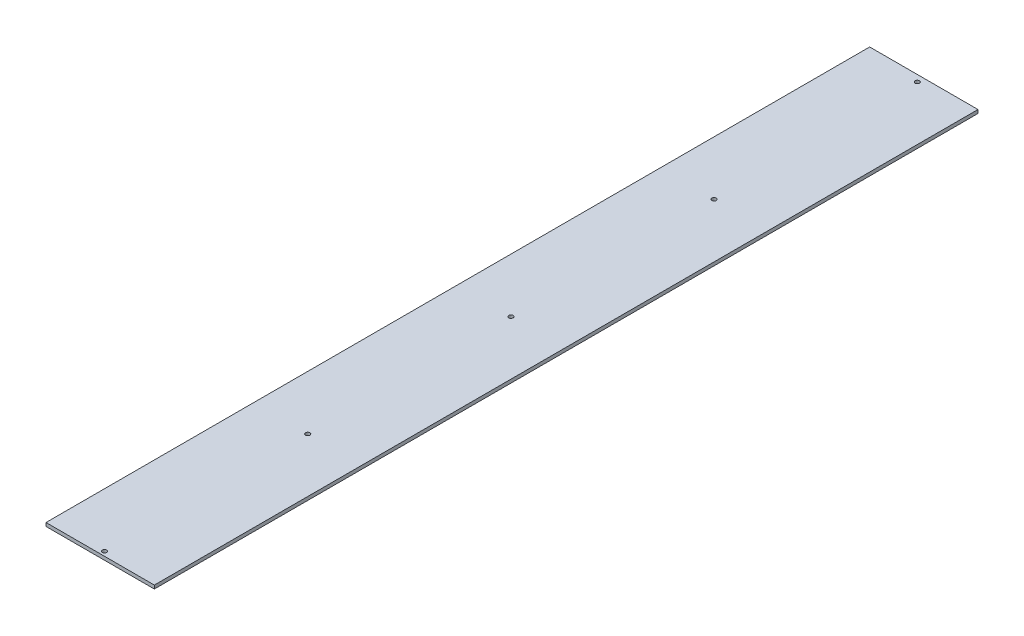
ISO-10303-21;
HEADER;
FILE_DESCRIPTION(('STEP AP214'),'2;1');
FILE_NAME('part.step','',(''),(''),'','','');
FILE_SCHEMA(('AUTOMOTIVE_DESIGN { 1 0 10303 214 1 1 1 1 }'));
ENDSEC;
DATA;
#1=APPLICATION_CONTEXT('core data for automotive mechanical design processes');
#2=APPLICATION_PROTOCOL_DEFINITION('international standard','automotive_design',2000,#1);
#3=PRODUCT_CONTEXT('',#1,'mechanical');
#4=PRODUCT('Part','Part','',(#3));
#5=PRODUCT_RELATED_PRODUCT_CATEGORY('part','',(#4));
#6=PRODUCT_DEFINITION_FORMATION('','',#4);
#7=PRODUCT_DEFINITION_CONTEXT('part definition',#1,'design');
#8=PRODUCT_DEFINITION('design','',#6,#7);
#9=PRODUCT_DEFINITION_SHAPE('','',#8);
#10=(LENGTH_UNIT() NAMED_UNIT(*) SI_UNIT(.MILLI.,.METRE.));
#11=(NAMED_UNIT(*) PLANE_ANGLE_UNIT() SI_UNIT($,.RADIAN.));
#12=(NAMED_UNIT(*) SI_UNIT($,.STERADIAN.) SOLID_ANGLE_UNIT());
#13=UNCERTAINTY_MEASURE_WITH_UNIT(LENGTH_MEASURE(1.E-05),#10,'distance_accuracy_value','');
#14=(GEOMETRIC_REPRESENTATION_CONTEXT(3) GLOBAL_UNCERTAINTY_ASSIGNED_CONTEXT((#13)) GLOBAL_UNIT_ASSIGNED_CONTEXT((#10,
#11,#12)) REPRESENTATION_CONTEXT('',''));
#15=CARTESIAN_POINT('',(0.,0.,0.));
#16=DIRECTION('',(0.,0.,1.));
#17=DIRECTION('',(1.,0.,0.));
#18=AXIS2_PLACEMENT_3D('',#15,#16,#17);
#19=CARTESIAN_POINT('',(25.,-1.6,190.075));
#20=DIRECTION('',(1.,0.,0.));
#21=DIRECTION('',(0.,0.,-1.));
#22=AXIS2_PLACEMENT_3D('',#19,#20,#21);
#23=PLANE('',#22);
#24=DIRECTION('',(0.,0.,-1.));
#25=VECTOR('',#24,1.);
#26=CARTESIAN_POINT('',(25.,0.,190.075));
#27=LINE('',#26,#25);
#28=CARTESIAN_POINT('',(25.,0.,190.075));
#29=VERTEX_POINT('',#28);
#30=CARTESIAN_POINT('',(25.,0.,-190.075));
#31=VERTEX_POINT('',#30);
#32=EDGE_CURVE('E109',#29,#31,#27,.T.);
#33=ORIENTED_EDGE('',*,*,#32,.F.);
#34=DIRECTION('',(0.,1.,0.));
#35=VECTOR('',#34,1.);
#36=CARTESIAN_POINT('',(25.,-1.6,190.075));
#37=LINE('',#36,#35);
#38=CARTESIAN_POINT('',(25.,-1.6,190.075));
#39=VERTEX_POINT('',#38);
#40=EDGE_CURVE('E56',#39,#29,#37,.T.);
#41=ORIENTED_EDGE('',*,*,#40,.F.);
#42=DIRECTION('',(0.,0.,-1.));
#43=VECTOR('',#42,1.);
#44=CARTESIAN_POINT('',(25.,-1.6,190.075));
#45=LINE('',#44,#43);
#46=CARTESIAN_POINT('',(25.,-1.6,-190.075));
#47=VERTEX_POINT('',#46);
#48=EDGE_CURVE('E102',#39,#47,#45,.T.);
#49=ORIENTED_EDGE('',*,*,#48,.T.);
#50=DIRECTION('',(0.,1.,0.));
#51=VECTOR('',#50,1.);
#52=CARTESIAN_POINT('',(25.,-1.6,-190.075));
#53=LINE('',#52,#51);
#54=EDGE_CURVE('E84',#47,#31,#53,.T.);
#55=ORIENTED_EDGE('',*,*,#54,.T.);
#56=EDGE_LOOP('',(#33,#41,#49,#55));
#57=FACE_BOUND('',#56,.T.);
#58=ADVANCED_FACE('F39',(#57),#23,.T.);
#59=CARTESIAN_POINT('',(-25.,-1.6,190.075));
#60=DIRECTION('',(0.,0.,1.));
#61=DIRECTION('',(1.,0.,0.));
#62=AXIS2_PLACEMENT_3D('',#59,#60,#61);
#63=PLANE('',#62);
#64=DIRECTION('',(1.,0.,0.));
#65=VECTOR('',#64,1.);
#66=CARTESIAN_POINT('',(-25.,0.,190.075));
#67=LINE('',#66,#65);
#68=CARTESIAN_POINT('',(-25.,0.,190.075));
#69=VERTEX_POINT('',#68);
#70=EDGE_CURVE('E104',#69,#29,#67,.T.);
#71=ORIENTED_EDGE('',*,*,#70,.F.);
#72=DIRECTION('',(0.,1.,0.));
#73=VECTOR('',#72,1.);
#74=CARTESIAN_POINT('',(-25.,-1.6,190.075));
#75=LINE('',#74,#73);
#76=CARTESIAN_POINT('',(-25.,-1.6,190.075));
#77=VERTEX_POINT('',#76);
#78=EDGE_CURVE('E73',#77,#69,#75,.T.);
#79=ORIENTED_EDGE('',*,*,#78,.F.);
#80=DIRECTION('',(1.,0.,0.));
#81=VECTOR('',#80,1.);
#82=CARTESIAN_POINT('',(-25.,-1.6,190.075));
#83=LINE('',#82,#81);
#84=EDGE_CURVE('E99',#77,#39,#83,.T.);
#85=ORIENTED_EDGE('',*,*,#84,.T.);
#86=ORIENTED_EDGE('',*,*,#40,.T.);
#87=EDGE_LOOP('',(#71,#79,#85,#86));
#88=FACE_BOUND('',#87,.T.);
#89=ADVANCED_FACE('F153',(#88),#63,.T.);
#90=CARTESIAN_POINT('',(-25.,-1.6,190.075));
#91=DIRECTION('',(-1.,0.,0.));
#92=DIRECTION('',(0.,0.,1.));
#93=AXIS2_PLACEMENT_3D('',#90,#91,#92);
#94=PLANE('',#93);
#95=DIRECTION('',(0.,0.,1.));
#96=VECTOR('',#95,1.);
#97=CARTESIAN_POINT('',(-25.,0.,190.075));
#98=LINE('',#97,#96);
#99=CARTESIAN_POINT('',(-25.,0.,-190.075));
#100=VERTEX_POINT('',#99);
#101=EDGE_CURVE('E92',#100,#69,#98,.T.);
#102=ORIENTED_EDGE('',*,*,#101,.F.);
#103=DIRECTION('',(0.,1.,0.));
#104=VECTOR('',#103,1.);
#105=CARTESIAN_POINT('',(-25.,-1.6,-190.075));
#106=LINE('',#105,#104);
#107=CARTESIAN_POINT('',(-25.,-1.6,-190.075));
#108=VERTEX_POINT('',#107);
#109=EDGE_CURVE('E87',#108,#100,#106,.T.);
#110=ORIENTED_EDGE('',*,*,#109,.F.);
#111=DIRECTION('',(0.,0.,1.));
#112=VECTOR('',#111,1.);
#113=CARTESIAN_POINT('',(-25.,-1.6,190.075));
#114=LINE('',#113,#112);
#115=EDGE_CURVE('E90',#108,#77,#114,.T.);
#116=ORIENTED_EDGE('',*,*,#115,.T.);
#117=ORIENTED_EDGE('',*,*,#78,.T.);
#118=EDGE_LOOP('',(#102,#110,#116,#117));
#119=FACE_BOUND('',#118,.T.);
#120=ADVANCED_FACE('F89',(#119),#94,.T.);
#121=CARTESIAN_POINT('',(-25.,-1.6,-190.075));
#122=DIRECTION('',(0.,0.,-1.));
#123=DIRECTION('',(-1.,0.,0.));
#124=AXIS2_PLACEMENT_3D('',#121,#122,#123);
#125=PLANE('',#124);
#126=DIRECTION('',(-1.,0.,0.));
#127=VECTOR('',#126,1.);
#128=CARTESIAN_POINT('',(-25.,0.,-190.075));
#129=LINE('',#128,#127);
#130=EDGE_CURVE('E112',#31,#100,#129,.T.);
#131=ORIENTED_EDGE('',*,*,#130,.F.);
#132=ORIENTED_EDGE('',*,*,#54,.F.);
#133=DIRECTION('',(-1.,0.,0.));
#134=VECTOR('',#133,1.);
#135=CARTESIAN_POINT('',(-25.,-1.6,-190.075));
#136=LINE('',#135,#134);
#137=EDGE_CURVE('E98',#47,#108,#136,.T.);
#138=ORIENTED_EDGE('',*,*,#137,.T.);
#139=ORIENTED_EDGE('',*,*,#109,.T.);
#140=EDGE_LOOP('',(#131,#132,#138,#139));
#141=FACE_BOUND('',#140,.T.);
#142=ADVANCED_FACE('F101',(#141),#125,.T.);
#143=CARTESIAN_POINT('',(0.,-1.6,0.));
#144=DIRECTION('',(0.,-1.,0.));
#145=DIRECTION('',(0.,0.,-1.));
#146=AXIS2_PLACEMENT_3D('',#143,#144,#145);
#147=PLANE('',#146);
#148=CARTESIAN_POINT('',(0.,-1.6,-93.2875));
#149=DIRECTION('',(0.,-1.,0.));
#150=DIRECTION('',(0.,0.,-1.));
#151=AXIS2_PLACEMENT_3D('',#148,#149,#150);
#152=CIRCLE('',#151,1.);
#153=CARTESIAN_POINT('',(0.,-1.6,-94.2875));
#154=VERTEX_POINT('',#153);
#155=EDGE_CURVE('E276',#154,#154,#152,.T.);
#156=ORIENTED_EDGE('',*,*,#155,.F.);
#157=EDGE_LOOP('',(#156));
#158=FACE_BOUND('',#157,.T.);
#159=CARTESIAN_POINT('',(0.,-1.6,-187.075));
#160=DIRECTION('',(0.,-1.,0.));
#161=DIRECTION('',(0.,0.,-1.));
#162=AXIS2_PLACEMENT_3D('',#159,#160,#161);
#163=CIRCLE('',#162,1.);
#164=CARTESIAN_POINT('',(0.,-1.6,-188.075));
#165=VERTEX_POINT('',#164);
#166=EDGE_CURVE('E113',#165,#165,#163,.T.);
#167=ORIENTED_EDGE('',*,*,#166,.F.);
#168=EDGE_LOOP('',(#167));
#169=FACE_BOUND('',#168,.T.);
#170=ORIENTED_EDGE('',*,*,#48,.F.);
#171=ORIENTED_EDGE('',*,*,#84,.F.);
#172=ORIENTED_EDGE('',*,*,#115,.F.);
#173=ORIENTED_EDGE('',*,*,#137,.F.);
#174=EDGE_LOOP('',(#170,#171,#172,#173));
#175=FACE_BOUND('',#174,.T.);
#176=CARTESIAN_POINT('',(0.,-1.6,0.5));
#177=DIRECTION('',(0.,-1.,0.));
#178=DIRECTION('',(0.,0.,-1.));
#179=AXIS2_PLACEMENT_3D('',#176,#177,#178);
#180=CIRCLE('',#179,1.);
#181=CARTESIAN_POINT('',(0.,-1.6,-0.5));
#182=VERTEX_POINT('',#181);
#183=EDGE_CURVE('E119',#182,#182,#180,.T.);
#184=ORIENTED_EDGE('',*,*,#183,.F.);
#185=EDGE_LOOP('',(#184));
#186=FACE_BOUND('',#185,.T.);
#187=CARTESIAN_POINT('',(0.,-1.6,94.2875));
#188=DIRECTION('',(0.,-1.,0.));
#189=DIRECTION('',(0.,0.,-1.));
#190=AXIS2_PLACEMENT_3D('',#187,#188,#189);
#191=CIRCLE('',#190,1.);
#192=CARTESIAN_POINT('',(0.,-1.6,93.2875));
#193=VERTEX_POINT('',#192);
#194=EDGE_CURVE('E127',#193,#193,#191,.T.);
#195=ORIENTED_EDGE('',*,*,#194,.F.);
#196=EDGE_LOOP('',(#195));
#197=FACE_BOUND('',#196,.T.);
#198=CARTESIAN_POINT('',(0.,-1.6,188.075));
#199=DIRECTION('',(0.,-1.,0.));
#200=DIRECTION('',(0.,0.,-1.));
#201=AXIS2_PLACEMENT_3D('',#198,#199,#200);
#202=CIRCLE('',#201,1.);
#203=CARTESIAN_POINT('',(0.,-1.6,187.075));
#204=VERTEX_POINT('',#203);
#205=EDGE_CURVE('E48',#204,#204,#202,.T.);
#206=ORIENTED_EDGE('',*,*,#205,.F.);
#207=EDGE_LOOP('',(#206));
#208=FACE_BOUND('',#207,.T.);
#209=ADVANCED_FACE('F96',(#158,#169,#175,#186,#197,#208),#147,.T.);
#210=CARTESIAN_POINT('',(0.,0.,0.));
#211=DIRECTION('',(0.,-1.,0.));
#212=DIRECTION('',(0.,0.,-1.));
#213=AXIS2_PLACEMENT_3D('',#210,#211,#212);
#214=PLANE('',#213);
#215=CARTESIAN_POINT('',(0.,0.,-93.2875));
#216=DIRECTION('',(0.,1.,0.));
#217=DIRECTION('',(0.,0.,1.));
#218=AXIS2_PLACEMENT_3D('',#215,#216,#217);
#219=CIRCLE('',#218,1.);
#220=CARTESIAN_POINT('',(0.,0.,-92.2875));
#221=VERTEX_POINT('',#220);
#222=EDGE_CURVE('E273',#221,#221,#219,.T.);
#223=ORIENTED_EDGE('',*,*,#222,.F.);
#224=EDGE_LOOP('',(#223));
#225=FACE_BOUND('',#224,.T.);
#226=CARTESIAN_POINT('',(0.,0.,-187.075));
#227=DIRECTION('',(0.,1.,0.));
#228=DIRECTION('',(0.,0.,1.));
#229=AXIS2_PLACEMENT_3D('',#226,#227,#228);
#230=CIRCLE('',#229,1.);
#231=CARTESIAN_POINT('',(0.,0.,-186.075));
#232=VERTEX_POINT('',#231);
#233=EDGE_CURVE('E271',#232,#232,#230,.T.);
#234=ORIENTED_EDGE('',*,*,#233,.F.);
#235=EDGE_LOOP('',(#234));
#236=FACE_BOUND('',#235,.T.);
#237=ORIENTED_EDGE('',*,*,#32,.T.);
#238=ORIENTED_EDGE('',*,*,#130,.T.);
#239=ORIENTED_EDGE('',*,*,#101,.T.);
#240=ORIENTED_EDGE('',*,*,#70,.T.);
#241=EDGE_LOOP('',(#237,#238,#239,#240));
#242=FACE_BOUND('',#241,.T.);
#243=CARTESIAN_POINT('',(0.,0.,0.5));
#244=DIRECTION('',(0.,1.,0.));
#245=DIRECTION('',(0.,0.,1.));
#246=AXIS2_PLACEMENT_3D('',#243,#244,#245);
#247=CIRCLE('',#246,1.);
#248=CARTESIAN_POINT('',(0.,0.,1.5));
#249=VERTEX_POINT('',#248);
#250=EDGE_CURVE('E124',#249,#249,#247,.T.);
#251=ORIENTED_EDGE('',*,*,#250,.F.);
#252=EDGE_LOOP('',(#251));
#253=FACE_BOUND('',#252,.T.);
#254=CARTESIAN_POINT('',(0.,0.,94.2875));
#255=DIRECTION('',(0.,1.,0.));
#256=DIRECTION('',(0.,0.,1.));
#257=AXIS2_PLACEMENT_3D('',#254,#255,#256);
#258=CIRCLE('',#257,1.);
#259=CARTESIAN_POINT('',(0.,0.,95.2875));
#260=VERTEX_POINT('',#259);
#261=EDGE_CURVE('E130',#260,#260,#258,.T.);
#262=ORIENTED_EDGE('',*,*,#261,.F.);
#263=EDGE_LOOP('',(#262));
#264=FACE_BOUND('',#263,.T.);
#265=CARTESIAN_POINT('',(0.,0.,188.075));
#266=DIRECTION('',(0.,1.,0.));
#267=DIRECTION('',(0.,0.,1.));
#268=AXIS2_PLACEMENT_3D('',#265,#266,#267);
#269=CIRCLE('',#268,1.);
#270=CARTESIAN_POINT('',(0.,0.,189.075));
#271=VERTEX_POINT('',#270);
#272=EDGE_CURVE('E11',#271,#271,#269,.T.);
#273=ORIENTED_EDGE('',*,*,#272,.F.);
#274=EDGE_LOOP('',(#273));
#275=FACE_BOUND('',#274,.T.);
#276=ADVANCED_FACE('F138',(#225,#236,#242,#253,#264,#275),#214,.F.);
#277=CARTESIAN_POINT('',(0.,-10.,-187.075));
#278=DIRECTION('',(0.,1.,0.));
#279=DIRECTION('',(0.,0.,1.));
#280=AXIS2_PLACEMENT_3D('',#277,#278,#279);
#281=CYLINDRICAL_SURFACE('',#280,1.);
#282=ORIENTED_EDGE('',*,*,#166,.T.);
#283=EDGE_LOOP('',(#282));
#284=FACE_BOUND('',#283,.T.);
#285=ORIENTED_EDGE('',*,*,#233,.T.);
#286=EDGE_LOOP('',(#285));
#287=FACE_BOUND('',#286,.T.);
#288=ADVANCED_FACE('F145',(#284,#287),#281,.F.);
#289=CARTESIAN_POINT('',(0.,-10.,-93.2875));
#290=DIRECTION('',(0.,1.,0.));
#291=DIRECTION('',(0.,0.,1.));
#292=AXIS2_PLACEMENT_3D('',#289,#290,#291);
#293=CYLINDRICAL_SURFACE('',#292,1.);
#294=ORIENTED_EDGE('',*,*,#155,.T.);
#295=EDGE_LOOP('',(#294));
#296=FACE_BOUND('',#295,.T.);
#297=ORIENTED_EDGE('',*,*,#222,.T.);
#298=EDGE_LOOP('',(#297));
#299=FACE_BOUND('',#298,.T.);
#300=ADVANCED_FACE('F164',(#296,#299),#293,.F.);
#301=CARTESIAN_POINT('',(0.,-10.,0.5));
#302=DIRECTION('',(0.,1.,0.));
#303=DIRECTION('',(0.,0.,1.));
#304=AXIS2_PLACEMENT_3D('',#301,#302,#303);
#305=CYLINDRICAL_SURFACE('',#304,1.);
#306=ORIENTED_EDGE('',*,*,#183,.T.);
#307=EDGE_LOOP('',(#306));
#308=FACE_BOUND('',#307,.T.);
#309=ORIENTED_EDGE('',*,*,#250,.T.);
#310=EDGE_LOOP('',(#309));
#311=FACE_BOUND('',#310,.T.);
#312=ADVANCED_FACE('F161',(#308,#311),#305,.F.);
#313=CARTESIAN_POINT('',(0.,-10.,94.2875));
#314=DIRECTION('',(0.,1.,0.));
#315=DIRECTION('',(0.,0.,1.));
#316=AXIS2_PLACEMENT_3D('',#313,#314,#315);
#317=CYLINDRICAL_SURFACE('',#316,1.);
#318=ORIENTED_EDGE('',*,*,#194,.T.);
#319=EDGE_LOOP('',(#318));
#320=FACE_BOUND('',#319,.T.);
#321=ORIENTED_EDGE('',*,*,#261,.T.);
#322=EDGE_LOOP('',(#321));
#323=FACE_BOUND('',#322,.T.);
#324=ADVANCED_FACE('F163',(#320,#323),#317,.F.);
#325=CARTESIAN_POINT('',(0.,-10.,188.075));
#326=DIRECTION('',(0.,1.,0.));
#327=DIRECTION('',(0.,0.,1.));
#328=AXIS2_PLACEMENT_3D('',#325,#326,#327);
#329=CYLINDRICAL_SURFACE('',#328,1.);
#330=ORIENTED_EDGE('',*,*,#205,.T.);
#331=EDGE_LOOP('',(#330));
#332=FACE_BOUND('',#331,.T.);
#333=ORIENTED_EDGE('',*,*,#272,.T.);
#334=EDGE_LOOP('',(#333));
#335=FACE_BOUND('',#334,.T.);
#336=ADVANCED_FACE('F41',(#332,#335),#329,.F.);
#337=CLOSED_SHELL('',(#58,#89,#120,#142,#209,#276,#288,#300,#312,#324,#336));
#338=MANIFOLD_SOLID_BREP('B2',#337);
#339=ADVANCED_BREP_SHAPE_REPRESENTATION('',(#18,#338),#14);
#340=SHAPE_DEFINITION_REPRESENTATION(#9,#339);
ENDSEC;
END-ISO-10303-21;
